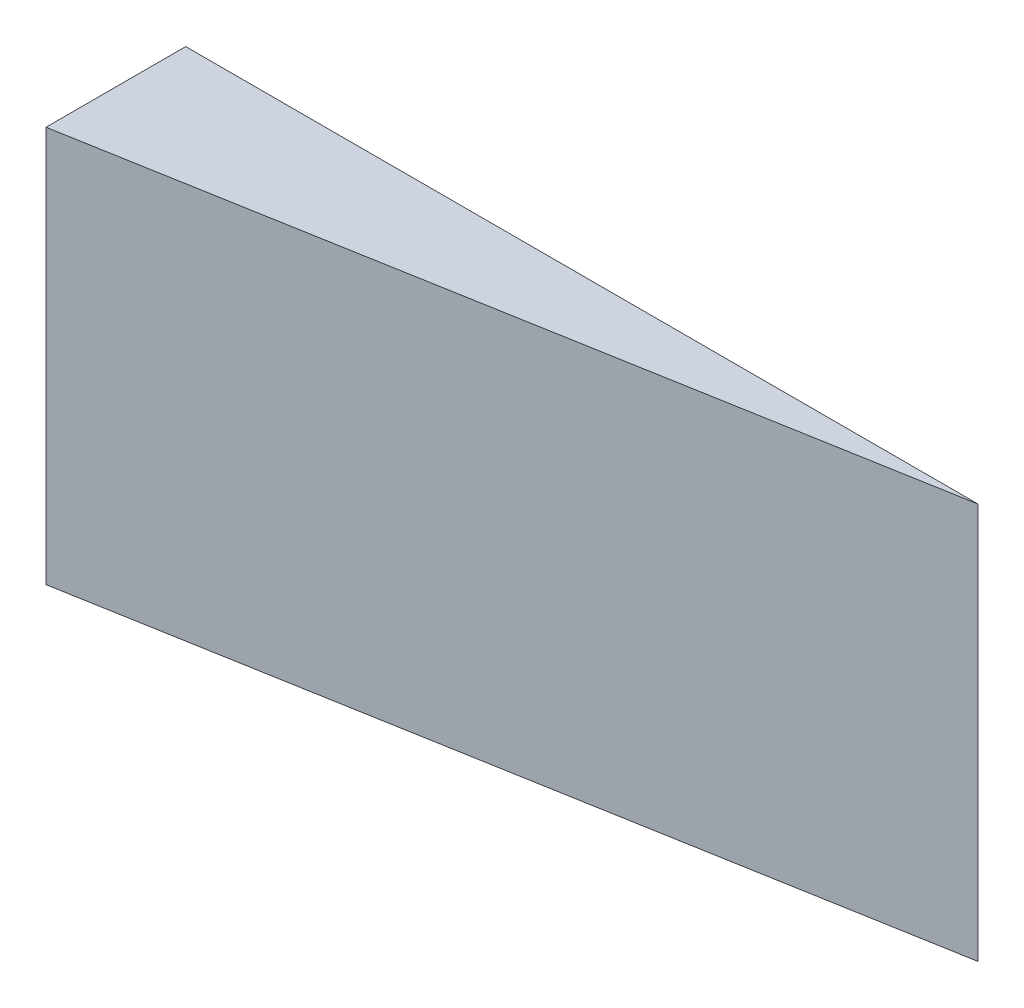
ISO-10303-21;
HEADER;
FILE_DESCRIPTION(('STEP AP214'),'2;1');
FILE_NAME('part.step','',(''),(''),'','','');
FILE_SCHEMA(('AUTOMOTIVE_DESIGN { 1 0 10303 214 1 1 1 1 }'));
ENDSEC;
DATA;
#1=APPLICATION_CONTEXT('core data for automotive mechanical design processes');
#2=APPLICATION_PROTOCOL_DEFINITION('international standard','automotive_design',2000,#1);
#3=PRODUCT_CONTEXT('',#1,'mechanical');
#4=PRODUCT('Part','Part','',(#3));
#5=PRODUCT_RELATED_PRODUCT_CATEGORY('part','',(#4));
#6=PRODUCT_DEFINITION_FORMATION('','',#4);
#7=PRODUCT_DEFINITION_CONTEXT('part definition',#1,'design');
#8=PRODUCT_DEFINITION('design','',#6,#7);
#9=PRODUCT_DEFINITION_SHAPE('','',#8);
#10=(LENGTH_UNIT() NAMED_UNIT(*) SI_UNIT(.MILLI.,.METRE.));
#11=(NAMED_UNIT(*) PLANE_ANGLE_UNIT() SI_UNIT($,.RADIAN.));
#12=(NAMED_UNIT(*) SI_UNIT($,.STERADIAN.) SOLID_ANGLE_UNIT());
#13=UNCERTAINTY_MEASURE_WITH_UNIT(LENGTH_MEASURE(1.E-05),#10,'distance_accuracy_value','');
#14=(GEOMETRIC_REPRESENTATION_CONTEXT(3) GLOBAL_UNCERTAINTY_ASSIGNED_CONTEXT((#13)) GLOBAL_UNIT_ASSIGNED_CONTEXT((#10,
#11,#12)) REPRESENTATION_CONTEXT('',''));
#15=CARTESIAN_POINT('',(0.,0.,0.));
#16=DIRECTION('',(0.,0.,1.));
#17=DIRECTION('',(1.,0.,0.));
#18=AXIS2_PLACEMENT_3D('',#15,#16,#17);
#19=CARTESIAN_POINT('',(0.,20.,7.05307922833832));
#20=DIRECTION('',(1.,0.,0.));
#21=DIRECTION('',(0.,0.,-1.));
#22=AXIS2_PLACEMENT_3D('',#19,#20,#21);
#23=PLANE('',#22);
#24=DIRECTION('',(0.,0.,1.));
#25=VECTOR('',#24,1.);
#26=CARTESIAN_POINT('',(0.,0.,7.05307922833832));
#27=LINE('',#26,#25);
#28=CARTESIAN_POINT('',(0.,0.,0.));
#29=VERTEX_POINT('',#28);
#30=CARTESIAN_POINT('',(0.,0.,7.05307922833832));
#31=VERTEX_POINT('',#30);
#32=EDGE_CURVE('E89',#29,#31,#27,.T.);
#33=ORIENTED_EDGE('',*,*,#32,.T.);
#34=DIRECTION('',(0.,-1.,0.));
#35=VECTOR('',#34,1.);
#36=CARTESIAN_POINT('',(0.,20.,7.05307922833832));
#37=LINE('',#36,#35);
#38=CARTESIAN_POINT('',(0.,20.,7.05307922833832));
#39=VERTEX_POINT('',#38);
#40=EDGE_CURVE('E11',#39,#31,#37,.T.);
#41=ORIENTED_EDGE('',*,*,#40,.F.);
#42=DIRECTION('',(0.,0.,1.));
#43=VECTOR('',#42,1.);
#44=CARTESIAN_POINT('',(0.,20.,7.05307922833832));
#45=LINE('',#44,#43);
#46=CARTESIAN_POINT('',(0.,20.,0.));
#47=VERTEX_POINT('',#46);
#48=EDGE_CURVE('E81',#47,#39,#45,.T.);
#49=ORIENTED_EDGE('',*,*,#48,.F.);
#50=DIRECTION('',(0.,-1.,0.));
#51=VECTOR('',#50,1.);
#52=CARTESIAN_POINT('',(0.,20.,0.));
#53=LINE('',#52,#51);
#54=EDGE_CURVE('E90',#47,#29,#53,.T.);
#55=ORIENTED_EDGE('',*,*,#54,.T.);
#56=EDGE_LOOP('',(#33,#41,#49,#55));
#57=FACE_BOUND('',#56,.T.);
#58=ADVANCED_FACE('F39',(#57),#23,.F.);
#59=CARTESIAN_POINT('',(40.,20.,0.));
#60=DIRECTION('',(-0.173648177666924,0.,-0.984807753012209));
#61=DIRECTION('',(-0.984807753012209,0.,0.173648177666924));
#62=AXIS2_PLACEMENT_3D('',#59,#60,#61);
#63=PLANE('',#62);
#64=DIRECTION('',(0.984807753012209,0.,-0.173648177666924));
#65=VECTOR('',#64,1.);
#66=CARTESIAN_POINT('',(40.,0.,0.));
#67=LINE('',#66,#65);
#68=CARTESIAN_POINT('',(40.,0.,0.));
#69=VERTEX_POINT('',#68);
#70=EDGE_CURVE('E68',#31,#69,#67,.T.);
#71=ORIENTED_EDGE('',*,*,#70,.T.);
#72=DIRECTION('',(0.,-1.,0.));
#73=VECTOR('',#72,1.);
#74=CARTESIAN_POINT('',(40.,20.,0.));
#75=LINE('',#74,#73);
#76=CARTESIAN_POINT('',(40.,20.,0.));
#77=VERTEX_POINT('',#76);
#78=EDGE_CURVE('E48',#77,#69,#75,.T.);
#79=ORIENTED_EDGE('',*,*,#78,.F.);
#80=DIRECTION('',(0.984807753012209,0.,-0.173648177666924));
#81=VECTOR('',#80,1.);
#82=CARTESIAN_POINT('',(40.,20.,0.));
#83=LINE('',#82,#81);
#84=EDGE_CURVE('E76',#39,#77,#83,.T.);
#85=ORIENTED_EDGE('',*,*,#84,.F.);
#86=ORIENTED_EDGE('',*,*,#40,.T.);
#87=EDGE_LOOP('',(#71,#79,#85,#86));
#88=FACE_BOUND('',#87,.T.);
#89=ADVANCED_FACE('F77',(#88),#63,.F.);
#90=CARTESIAN_POINT('',(0.,20.,0.));
#91=DIRECTION('',(0.,0.,1.));
#92=DIRECTION('',(1.,0.,0.));
#93=AXIS2_PLACEMENT_3D('',#90,#91,#92);
#94=PLANE('',#93);
#95=DIRECTION('',(-1.,0.,0.));
#96=VECTOR('',#95,1.);
#97=CARTESIAN_POINT('',(0.,0.,0.));
#98=LINE('',#97,#96);
#99=EDGE_CURVE('E73',#69,#29,#98,.T.);
#100=ORIENTED_EDGE('',*,*,#99,.T.);
#101=ORIENTED_EDGE('',*,*,#54,.F.);
#102=DIRECTION('',(-1.,0.,0.));
#103=VECTOR('',#102,1.);
#104=CARTESIAN_POINT('',(0.,20.,0.));
#105=LINE('',#104,#103);
#106=EDGE_CURVE('E56',#77,#47,#105,.T.);
#107=ORIENTED_EDGE('',*,*,#106,.F.);
#108=ORIENTED_EDGE('',*,*,#78,.T.);
#109=EDGE_LOOP('',(#100,#101,#107,#108));
#110=FACE_BOUND('',#109,.T.);
#111=ADVANCED_FACE('F102',(#110),#94,.F.);
#112=CARTESIAN_POINT('',(0.,20.,0.));
#113=DIRECTION('',(0.,-1.,0.));
#114=DIRECTION('',(0.,0.,-1.));
#115=AXIS2_PLACEMENT_3D('',#112,#113,#114);
#116=PLANE('',#115);
#117=ORIENTED_EDGE('',*,*,#48,.T.);
#118=ORIENTED_EDGE('',*,*,#84,.T.);
#119=ORIENTED_EDGE('',*,*,#106,.T.);
#120=EDGE_LOOP('',(#117,#118,#119));
#121=FACE_BOUND('',#120,.T.);
#122=ADVANCED_FACE('F84',(#121),#116,.F.);
#123=CARTESIAN_POINT('',(0.,0.,0.));
#124=DIRECTION('',(0.,-1.,0.));
#125=DIRECTION('',(0.,0.,-1.));
#126=AXIS2_PLACEMENT_3D('',#123,#124,#125);
#127=PLANE('',#126);
#128=ORIENTED_EDGE('',*,*,#32,.F.);
#129=ORIENTED_EDGE('',*,*,#99,.F.);
#130=ORIENTED_EDGE('',*,*,#70,.F.);
#131=EDGE_LOOP('',(#128,#129,#130));
#132=FACE_BOUND('',#131,.T.);
#133=ADVANCED_FACE('F103',(#132),#127,.T.);
#134=CLOSED_SHELL('',(#58,#89,#111,#122,#133));
#135=MANIFOLD_SOLID_BREP('B2',#134);
#136=ADVANCED_BREP_SHAPE_REPRESENTATION('',(#18,#135),#14);
#137=SHAPE_DEFINITION_REPRESENTATION(#9,#136);
ENDSEC;
END-ISO-10303-21;
